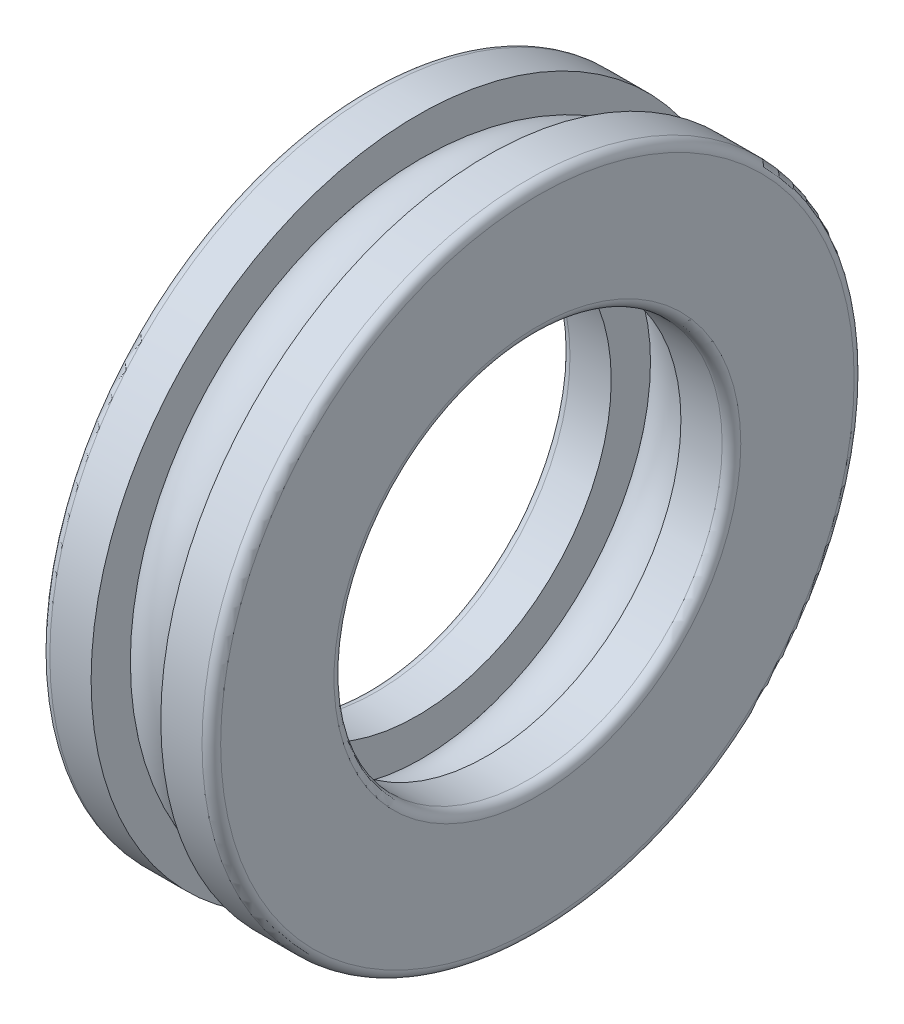
ISO-10303-21;
HEADER;
FILE_DESCRIPTION(('STEP AP214'),'2;1');
FILE_NAME('part.step','',(''),(''),'','','');
FILE_SCHEMA(('AUTOMOTIVE_DESIGN { 1 0 10303 214 1 1 1 1 }'));
ENDSEC;
DATA;
#1=APPLICATION_CONTEXT('core data for automotive mechanical design processes');
#2=APPLICATION_PROTOCOL_DEFINITION('international standard','automotive_design',2000,#1);
#3=PRODUCT_CONTEXT('',#1,'mechanical');
#4=PRODUCT('Part','Part','',(#3));
#5=PRODUCT_RELATED_PRODUCT_CATEGORY('part','',(#4));
#6=PRODUCT_DEFINITION_FORMATION('','',#4);
#7=PRODUCT_DEFINITION_CONTEXT('part definition',#1,'design');
#8=PRODUCT_DEFINITION('design','',#6,#7);
#9=PRODUCT_DEFINITION_SHAPE('','',#8);
#10=(LENGTH_UNIT() NAMED_UNIT(*) SI_UNIT(.MILLI.,.METRE.));
#11=(NAMED_UNIT(*) PLANE_ANGLE_UNIT() SI_UNIT($,.RADIAN.));
#12=(NAMED_UNIT(*) SI_UNIT($,.STERADIAN.) SOLID_ANGLE_UNIT());
#13=UNCERTAINTY_MEASURE_WITH_UNIT(LENGTH_MEASURE(1.E-05),#10,'distance_accuracy_value','');
#14=(GEOMETRIC_REPRESENTATION_CONTEXT(3) GLOBAL_UNCERTAINTY_ASSIGNED_CONTEXT((#13)) GLOBAL_UNIT_ASSIGNED_CONTEXT((#10,
#11,#12)) REPRESENTATION_CONTEXT('',''));
#15=CARTESIAN_POINT('',(0.,0.,0.));
#16=DIRECTION('',(0.,0.,1.));
#17=DIRECTION('',(1.,0.,0.));
#18=AXIS2_PLACEMENT_3D('',#15,#16,#17);
#19=CARTESIAN_POINT('',(0.,0.,0.));
#20=DIRECTION('',(-1.,0.,0.));
#21=DIRECTION('',(0.,0.,1.));
#22=AXIS2_PLACEMENT_3D('',#19,#20,#21);
#23=TOROIDAL_SURFACE('',#22,16.75,2.805);
#24=CARTESIAN_POINT('',(2.244,0.,0.));
#25=DIRECTION('',(-1.,0.,0.));
#26=DIRECTION('',(0.,0.,1.));
#27=AXIS2_PLACEMENT_3D('',#24,#25,#26);
#28=CIRCLE('',#27,18.433);
#29=CARTESIAN_POINT('',(2.244,0.,18.433));
#30=VERTEX_POINT('',#29);
#31=EDGE_CURVE('E35',#30,#30,#28,.T.);
#32=ORIENTED_EDGE('',*,*,#31,.T.);
#33=EDGE_LOOP('',(#32));
#34=FACE_BOUND('',#33,.T.);
#35=CARTESIAN_POINT('',(-2.244,0.,0.));
#36=DIRECTION('',(1.,0.,0.));
#37=DIRECTION('',(0.,0.,-1.));
#38=AXIS2_PLACEMENT_3D('',#35,#36,#37);
#39=CIRCLE('',#38,18.433);
#40=CARTESIAN_POINT('',(-2.244,0.,-18.433));
#41=VERTEX_POINT('',#40);
#42=EDGE_CURVE('E50',#41,#41,#39,.F.);
#43=ORIENTED_EDGE('',*,*,#42,.F.);
#44=EDGE_LOOP('',(#43));
#45=FACE_BOUND('',#44,.T.);
#46=ADVANCED_FACE('F31',(#34,#45),#23,.T.);
#47=CARTESIAN_POINT('',(-2.244,15.1090051797766,0.));
#48=DIRECTION('',(1.,0.,0.));
#49=DIRECTION('',(0.,0.,-1.));
#50=AXIS2_PLACEMENT_3D('',#47,#48,#49);
#51=PLANE('',#50);
#52=CARTESIAN_POINT('',(-2.244,0.,0.));
#53=DIRECTION('',(1.,0.,0.));
#54=DIRECTION('',(0.,0.,-1.));
#55=AXIS2_PLACEMENT_3D('',#52,#53,#54);
#56=CIRCLE('',#55,12.5);
#57=CARTESIAN_POINT('',(-2.244,0.,-12.5));
#58=VERTEX_POINT('',#57);
#59=EDGE_CURVE('E69',#58,#58,#56,.T.);
#60=ORIENTED_EDGE('',*,*,#59,.F.);
#61=EDGE_LOOP('',(#60));
#62=FACE_BOUND('',#61,.T.);
#63=CARTESIAN_POINT('',(-2.244,0.,0.));
#64=DIRECTION('',(-1.,0.,0.));
#65=DIRECTION('',(0.,0.,1.));
#66=AXIS2_PLACEMENT_3D('',#63,#64,#65);
#67=CIRCLE('',#66,15.067);
#68=CARTESIAN_POINT('',(-2.244,0.,15.067));
#69=VERTEX_POINT('',#68);
#70=EDGE_CURVE('E48',#69,#69,#67,.F.);
#71=ORIENTED_EDGE('',*,*,#70,.T.);
#72=EDGE_LOOP('',(#71));
#73=FACE_BOUND('',#72,.T.);
#74=ADVANCED_FACE('F98',(#62,#73),#51,.T.);
#75=CARTESIAN_POINT('',(-2.244,21.,0.));
#76=DIRECTION('',(1.,0.,0.));
#77=DIRECTION('',(0.,0.,-1.));
#78=AXIS2_PLACEMENT_3D('',#75,#76,#77);
#79=PLANE('',#78);
#80=ORIENTED_EDGE('',*,*,#42,.T.);
#81=EDGE_LOOP('',(#80));
#82=FACE_BOUND('',#81,.T.);
#83=CARTESIAN_POINT('',(-2.244,0.,0.));
#84=DIRECTION('',(1.,0.,0.));
#85=DIRECTION('',(0.,0.,-1.));
#86=AXIS2_PLACEMENT_3D('',#83,#84,#85);
#87=CIRCLE('',#86,21.);
#88=CARTESIAN_POINT('',(-2.244,0.,-21.));
#89=VERTEX_POINT('',#88);
#90=EDGE_CURVE('E10',#89,#89,#87,.T.);
#91=ORIENTED_EDGE('',*,*,#90,.T.);
#92=EDGE_LOOP('',(#91));
#93=FACE_BOUND('',#92,.T.);
#94=ADVANCED_FACE('F33',(#82,#93),#79,.T.);
#95=CARTESIAN_POINT('',(-34.925,0.,0.));
#96=DIRECTION('',(1.,0.,0.));
#97=DIRECTION('',(0.,0.,-1.));
#98=AXIS2_PLACEMENT_3D('',#95,#96,#97);
#99=CYLINDRICAL_SURFACE('',#98,21.);
#100=CARTESIAN_POINT('',(-4.9,0.,0.));
#101=DIRECTION('',(1.,0.,0.));
#102=DIRECTION('',(0.,0.,-1.));
#103=AXIS2_PLACEMENT_3D('',#100,#101,#102);
#104=CIRCLE('',#103,21.);
#105=CARTESIAN_POINT('',(-4.9,0.,-21.));
#106=VERTEX_POINT('',#105);
#107=EDGE_CURVE('E39',#106,#106,#104,.T.);
#108=ORIENTED_EDGE('',*,*,#107,.T.);
#109=EDGE_LOOP('',(#108));
#110=FACE_BOUND('',#109,.T.);
#111=ORIENTED_EDGE('',*,*,#90,.F.);
#112=EDGE_LOOP('',(#111));
#113=FACE_BOUND('',#112,.T.);
#114=ADVANCED_FACE('F95',(#110,#113),#99,.T.);
#115=CARTESIAN_POINT('',(-4.9,0.,0.));
#116=DIRECTION('',(1.,0.,0.));
#117=DIRECTION('',(0.,0.,-1.));
#118=AXIS2_PLACEMENT_3D('',#115,#116,#117);
#119=TOROIDAL_SURFACE('',#118,20.4,0.6);
#120=CARTESIAN_POINT('',(-5.5,0.,0.));
#121=DIRECTION('',(1.,0.,0.));
#122=DIRECTION('',(0.,0.,-1.));
#123=AXIS2_PLACEMENT_3D('',#120,#121,#122);
#124=CIRCLE('',#123,20.4);
#125=CARTESIAN_POINT('',(-5.5,0.,-20.4));
#126=VERTEX_POINT('',#125);
#127=EDGE_CURVE('E44',#126,#126,#124,.T.);
#128=ORIENTED_EDGE('',*,*,#127,.T.);
#129=EDGE_LOOP('',(#128));
#130=FACE_BOUND('',#129,.T.);
#131=ORIENTED_EDGE('',*,*,#107,.F.);
#132=EDGE_LOOP('',(#131));
#133=FACE_BOUND('',#132,.T.);
#134=ADVANCED_FACE('F80',(#130,#133),#119,.T.);
#135=CARTESIAN_POINT('',(-5.5,13.1,0.));
#136=DIRECTION('',(-1.,0.,0.));
#137=DIRECTION('',(0.,0.,1.));
#138=AXIS2_PLACEMENT_3D('',#135,#136,#137);
#139=PLANE('',#138);
#140=CARTESIAN_POINT('',(-5.5,0.,0.));
#141=DIRECTION('',(1.,0.,0.));
#142=DIRECTION('',(0.,0.,-1.));
#143=AXIS2_PLACEMENT_3D('',#140,#141,#142);
#144=CIRCLE('',#143,13.1);
#145=CARTESIAN_POINT('',(-5.5,0.,-13.1));
#146=VERTEX_POINT('',#145);
#147=EDGE_CURVE('E75',#146,#146,#144,.T.);
#148=ORIENTED_EDGE('',*,*,#147,.T.);
#149=EDGE_LOOP('',(#148));
#150=FACE_BOUND('',#149,.T.);
#151=ORIENTED_EDGE('',*,*,#127,.F.);
#152=EDGE_LOOP('',(#151));
#153=FACE_BOUND('',#152,.T.);
#154=ADVANCED_FACE('F83',(#150,#153),#139,.T.);
#155=CARTESIAN_POINT('',(-4.9,0.,0.));
#156=DIRECTION('',(1.,0.,0.));
#157=DIRECTION('',(0.,0.,-1.));
#158=AXIS2_PLACEMENT_3D('',#155,#156,#157);
#159=TOROIDAL_SURFACE('',#158,13.1,0.6);
#160=CARTESIAN_POINT('',(-4.9,0.,0.));
#161=DIRECTION('',(1.,0.,0.));
#162=DIRECTION('',(0.,0.,-1.));
#163=AXIS2_PLACEMENT_3D('',#160,#161,#162);
#164=CIRCLE('',#163,12.5);
#165=CARTESIAN_POINT('',(-4.9,0.,-12.5));
#166=VERTEX_POINT('',#165);
#167=EDGE_CURVE('E72',#166,#166,#164,.T.);
#168=ORIENTED_EDGE('',*,*,#167,.T.);
#169=EDGE_LOOP('',(#168));
#170=FACE_BOUND('',#169,.T.);
#171=ORIENTED_EDGE('',*,*,#147,.F.);
#172=EDGE_LOOP('',(#171));
#173=FACE_BOUND('',#172,.T.);
#174=ADVANCED_FACE('F85',(#170,#173),#159,.T.);
#175=CARTESIAN_POINT('',(-34.925,0.,0.));
#176=DIRECTION('',(1.,0.,0.));
#177=DIRECTION('',(0.,0.,-1.));
#178=AXIS2_PLACEMENT_3D('',#175,#176,#177);
#179=CYLINDRICAL_SURFACE('',#178,12.5);
#180=ORIENTED_EDGE('',*,*,#59,.T.);
#181=EDGE_LOOP('',(#180));
#182=FACE_BOUND('',#181,.T.);
#183=ORIENTED_EDGE('',*,*,#167,.F.);
#184=EDGE_LOOP('',(#183));
#185=FACE_BOUND('',#184,.T.);
#186=ADVANCED_FACE('F92',(#182,#185),#179,.F.);
#187=CARTESIAN_POINT('',(2.244,0.,0.));
#188=DIRECTION('',(1.,0.,0.));
#189=DIRECTION('',(0.,0.,-1.));
#190=AXIS2_PLACEMENT_3D('',#187,#188,#189);
#191=CIRCLE('',#190,15.067);
#192=CARTESIAN_POINT('',(2.244,0.,-15.067));
#193=VERTEX_POINT('',#192);
#194=EDGE_CURVE('E51',#193,#193,#191,.T.);
#195=ORIENTED_EDGE('',*,*,#194,.T.);
#196=EDGE_LOOP('',(#195));
#197=FACE_BOUND('',#196,.T.);
#198=ORIENTED_EDGE('',*,*,#70,.F.);
#199=EDGE_LOOP('',(#198));
#200=FACE_BOUND('',#199,.T.);
#201=ADVANCED_FACE('F101',(#197,#200),#23,.T.);
#202=CARTESIAN_POINT('',(2.244,15.1090051797766,0.));
#203=DIRECTION('',(-1.,0.,0.));
#204=DIRECTION('',(0.,0.,-1.));
#205=AXIS2_PLACEMENT_3D('',#202,#203,#204);
#206=PLANE('',#205);
#207=CARTESIAN_POINT('',(2.244,0.,0.));
#208=DIRECTION('',(1.,0.,0.));
#209=DIRECTION('',(0.,0.,-1.));
#210=AXIS2_PLACEMENT_3D('',#207,#208,#209);
#211=CIRCLE('',#210,12.5);
#212=CARTESIAN_POINT('',(2.244,0.,-12.5));
#213=VERTEX_POINT('',#212);
#214=EDGE_CURVE('E245',#213,#213,#211,.T.);
#215=ORIENTED_EDGE('',*,*,#214,.T.);
#216=EDGE_LOOP('',(#215));
#217=FACE_BOUND('',#216,.T.);
#218=ORIENTED_EDGE('',*,*,#194,.F.);
#219=EDGE_LOOP('',(#218));
#220=FACE_BOUND('',#219,.T.);
#221=ADVANCED_FACE('F110',(#217,#220),#206,.T.);
#222=CARTESIAN_POINT('',(2.244,21.,0.));
#223=DIRECTION('',(-1.,0.,0.));
#224=DIRECTION('',(0.,0.,-1.));
#225=AXIS2_PLACEMENT_3D('',#222,#223,#224);
#226=PLANE('',#225);
#227=ORIENTED_EDGE('',*,*,#31,.F.);
#228=EDGE_LOOP('',(#227));
#229=FACE_BOUND('',#228,.T.);
#230=CARTESIAN_POINT('',(2.244,0.,0.));
#231=DIRECTION('',(1.,0.,0.));
#232=DIRECTION('',(0.,0.,-1.));
#233=AXIS2_PLACEMENT_3D('',#230,#231,#232);
#234=CIRCLE('',#233,21.);
#235=CARTESIAN_POINT('',(2.244,0.,-21.));
#236=VERTEX_POINT('',#235);
#237=EDGE_CURVE('E53',#236,#236,#234,.T.);
#238=ORIENTED_EDGE('',*,*,#237,.F.);
#239=EDGE_LOOP('',(#238));
#240=FACE_BOUND('',#239,.T.);
#241=ADVANCED_FACE('F115',(#229,#240),#226,.T.);
#242=CARTESIAN_POINT('',(34.925,0.,0.));
#243=DIRECTION('',(-1.,0.,0.));
#244=DIRECTION('',(0.,0.,-1.));
#245=AXIS2_PLACEMENT_3D('',#242,#243,#244);
#246=CYLINDRICAL_SURFACE('',#245,21.);
#247=CARTESIAN_POINT('',(4.9,0.,0.));
#248=DIRECTION('',(1.,0.,0.));
#249=DIRECTION('',(0.,0.,-1.));
#250=AXIS2_PLACEMENT_3D('',#247,#248,#249);
#251=CIRCLE('',#250,21.);
#252=CARTESIAN_POINT('',(4.9,0.,-21.));
#253=VERTEX_POINT('',#252);
#254=EDGE_CURVE('E58',#253,#253,#251,.T.);
#255=ORIENTED_EDGE('',*,*,#254,.F.);
#256=EDGE_LOOP('',(#255));
#257=FACE_BOUND('',#256,.T.);
#258=ORIENTED_EDGE('',*,*,#237,.T.);
#259=EDGE_LOOP('',(#258));
#260=FACE_BOUND('',#259,.T.);
#261=ADVANCED_FACE('F189',(#257,#260),#246,.T.);
#262=CARTESIAN_POINT('',(4.9,0.,0.));
#263=DIRECTION('',(-1.,0.,0.));
#264=DIRECTION('',(0.,0.,-1.));
#265=AXIS2_PLACEMENT_3D('',#262,#263,#264);
#266=TOROIDAL_SURFACE('',#265,20.4,0.6);
#267=CARTESIAN_POINT('',(5.5,0.,0.));
#268=DIRECTION('',(1.,0.,0.));
#269=DIRECTION('',(0.,0.,-1.));
#270=AXIS2_PLACEMENT_3D('',#267,#268,#269);
#271=CIRCLE('',#270,20.4);
#272=CARTESIAN_POINT('',(5.5,0.,-20.4));
#273=VERTEX_POINT('',#272);
#274=EDGE_CURVE('E63',#273,#273,#271,.T.);
#275=ORIENTED_EDGE('',*,*,#274,.F.);
#276=EDGE_LOOP('',(#275));
#277=FACE_BOUND('',#276,.T.);
#278=ORIENTED_EDGE('',*,*,#254,.T.);
#279=EDGE_LOOP('',(#278));
#280=FACE_BOUND('',#279,.T.);
#281=ADVANCED_FACE('F197',(#277,#280),#266,.T.);
#282=CARTESIAN_POINT('',(5.5,13.1,0.));
#283=DIRECTION('',(1.,0.,0.));
#284=DIRECTION('',(0.,0.,1.));
#285=AXIS2_PLACEMENT_3D('',#282,#283,#284);
#286=PLANE('',#285);
#287=CARTESIAN_POINT('',(5.5,0.,0.));
#288=DIRECTION('',(1.,0.,0.));
#289=DIRECTION('',(0.,0.,-1.));
#290=AXIS2_PLACEMENT_3D('',#287,#288,#289);
#291=CIRCLE('',#290,13.1);
#292=CARTESIAN_POINT('',(5.5,0.,-13.1));
#293=VERTEX_POINT('',#292);
#294=EDGE_CURVE('E249',#293,#293,#291,.T.);
#295=ORIENTED_EDGE('',*,*,#294,.F.);
#296=EDGE_LOOP('',(#295));
#297=FACE_BOUND('',#296,.T.);
#298=ORIENTED_EDGE('',*,*,#274,.T.);
#299=EDGE_LOOP('',(#298));
#300=FACE_BOUND('',#299,.T.);
#301=ADVANCED_FACE('F206',(#297,#300),#286,.T.);
#302=CARTESIAN_POINT('',(4.9,0.,0.));
#303=DIRECTION('',(-1.,0.,0.));
#304=DIRECTION('',(0.,0.,-1.));
#305=AXIS2_PLACEMENT_3D('',#302,#303,#304);
#306=TOROIDAL_SURFACE('',#305,13.1,0.6);
#307=CARTESIAN_POINT('',(4.9,0.,0.));
#308=DIRECTION('',(1.,0.,0.));
#309=DIRECTION('',(0.,0.,-1.));
#310=AXIS2_PLACEMENT_3D('',#307,#308,#309);
#311=CIRCLE('',#310,12.5);
#312=CARTESIAN_POINT('',(4.9,0.,-12.5));
#313=VERTEX_POINT('',#312);
#314=EDGE_CURVE('E248',#313,#313,#311,.T.);
#315=ORIENTED_EDGE('',*,*,#314,.F.);
#316=EDGE_LOOP('',(#315));
#317=FACE_BOUND('',#316,.T.);
#318=ORIENTED_EDGE('',*,*,#294,.T.);
#319=EDGE_LOOP('',(#318));
#320=FACE_BOUND('',#319,.T.);
#321=ADVANCED_FACE('F215',(#317,#320),#306,.T.);
#322=CARTESIAN_POINT('',(34.925,0.,0.));
#323=DIRECTION('',(-1.,0.,0.));
#324=DIRECTION('',(0.,0.,-1.));
#325=AXIS2_PLACEMENT_3D('',#322,#323,#324);
#326=CYLINDRICAL_SURFACE('',#325,12.5);
#327=ORIENTED_EDGE('',*,*,#214,.F.);
#328=EDGE_LOOP('',(#327));
#329=FACE_BOUND('',#328,.T.);
#330=ORIENTED_EDGE('',*,*,#314,.T.);
#331=EDGE_LOOP('',(#330));
#332=FACE_BOUND('',#331,.T.);
#333=ADVANCED_FACE('F224',(#329,#332),#326,.F.);
#334=CLOSED_SHELL('',(#46,#74,#94,#114,#134,#154,#174,#186,#201,#221,#241,#261,#281,#301,#321,#333));
#335=MANIFOLD_SOLID_BREP('B2',#334);
#336=ADVANCED_BREP_SHAPE_REPRESENTATION('',(#18,#335),#14);
#337=SHAPE_DEFINITION_REPRESENTATION(#9,#336);
ENDSEC;
END-ISO-10303-21;
